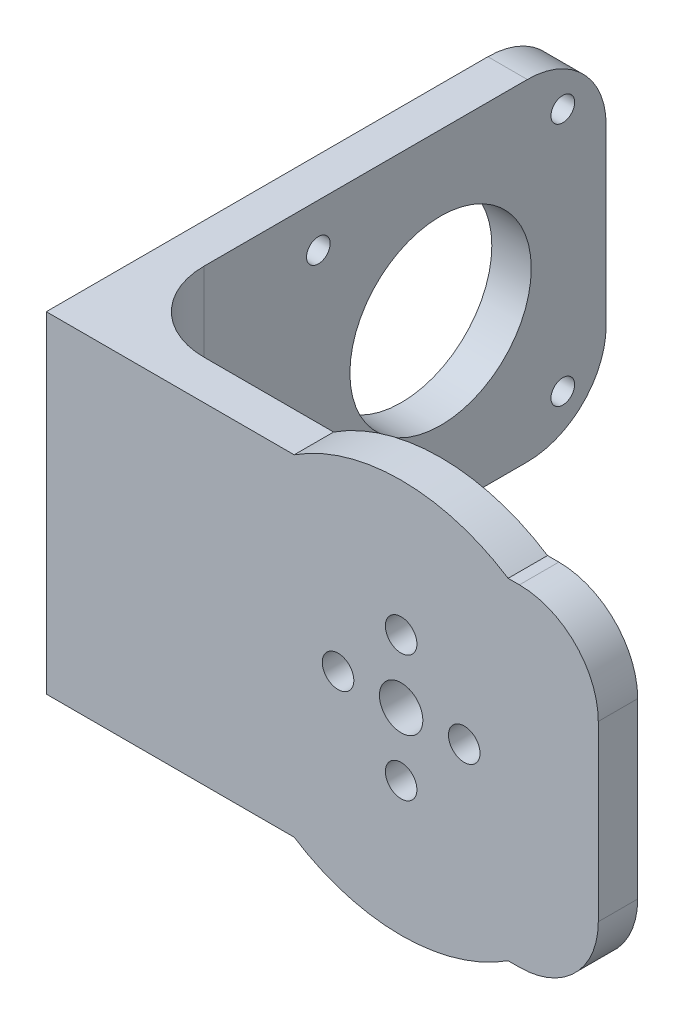
ISO-10303-21;
HEADER;
FILE_DESCRIPTION(('STEP AP214'),'2;1');
FILE_NAME('part.step','',(''),(''),'','','');
FILE_SCHEMA(('AUTOMOTIVE_DESIGN { 1 0 10303 214 1 1 1 1 }'));
ENDSEC;
DATA;
#1=APPLICATION_CONTEXT('core data for automotive mechanical design processes');
#2=APPLICATION_PROTOCOL_DEFINITION('international standard','automotive_design',2000,#1);
#3=PRODUCT_CONTEXT('',#1,'mechanical');
#4=PRODUCT('Part','Part','',(#3));
#5=PRODUCT_RELATED_PRODUCT_CATEGORY('part','',(#4));
#6=PRODUCT_DEFINITION_FORMATION('','',#4);
#7=PRODUCT_DEFINITION_CONTEXT('part definition',#1,'design');
#8=PRODUCT_DEFINITION('design','',#6,#7);
#9=PRODUCT_DEFINITION_SHAPE('','',#8);
#10=(LENGTH_UNIT() NAMED_UNIT(*) SI_UNIT(.MILLI.,.METRE.));
#11=(NAMED_UNIT(*) PLANE_ANGLE_UNIT() SI_UNIT($,.RADIAN.));
#12=(NAMED_UNIT(*) SI_UNIT($,.STERADIAN.) SOLID_ANGLE_UNIT());
#13=UNCERTAINTY_MEASURE_WITH_UNIT(LENGTH_MEASURE(1.E-05),#10,'distance_accuracy_value','');
#14=(GEOMETRIC_REPRESENTATION_CONTEXT(3) GLOBAL_UNCERTAINTY_ASSIGNED_CONTEXT((#13)) GLOBAL_UNIT_ASSIGNED_CONTEXT((#10,
#11,#12)) REPRESENTATION_CONTEXT('',''));
#15=CARTESIAN_POINT('',(0.,0.,0.));
#16=DIRECTION('',(0.,0.,1.));
#17=DIRECTION('',(1.,0.,0.));
#18=AXIS2_PLACEMENT_3D('',#15,#16,#17);
#19=CARTESIAN_POINT('',(0.,-21.,5.));
#20=DIRECTION('',(0.,-1.,0.));
#21=DIRECTION('',(0.,0.,-1.));
#22=AXIS2_PLACEMENT_3D('',#19,#20,#21);
#23=PLANE('',#22);
#24=DIRECTION('',(-1.,0.,0.));
#25=VECTOR('',#24,1.);
#26=CARTESIAN_POINT('',(0.,-21.,0.));
#27=LINE('',#26,#25);
#28=CARTESIAN_POINT('',(15.,-21.,0.));
#29=VERTEX_POINT('',#28);
#30=CARTESIAN_POINT('',(13.5646599662505,-21.,0.));
#31=VERTEX_POINT('',#30);
#32=EDGE_CURVE('E274',#29,#31,#27,.T.);
#33=ORIENTED_EDGE('',*,*,#32,.F.);
#34=DIRECTION('',(0.,0.,-1.));
#35=VECTOR('',#34,1.);
#36=CARTESIAN_POINT('',(15.,-21.,5.));
#37=LINE('',#36,#35);
#38=CARTESIAN_POINT('',(15.,-21.,5.));
#39=VERTEX_POINT('',#38);
#40=EDGE_CURVE('E335',#29,#39,#37,.F.);
#41=ORIENTED_EDGE('',*,*,#40,.T.);
#42=DIRECTION('',(-1.,0.,0.));
#43=VECTOR('',#42,1.);
#44=CARTESIAN_POINT('',(0.,-21.,5.));
#45=LINE('',#44,#43);
#46=CARTESIAN_POINT('',(13.5646599662505,-21.,5.));
#47=VERTEX_POINT('',#46);
#48=EDGE_CURVE('E277',#39,#47,#45,.T.);
#49=ORIENTED_EDGE('',*,*,#48,.T.);
#50=DIRECTION('',(0.,0.,-1.));
#51=VECTOR('',#50,1.);
#52=CARTESIAN_POINT('',(13.5646599662505,-21.,5.));
#53=LINE('',#52,#51);
#54=EDGE_CURVE('E279',#47,#31,#53,.T.);
#55=ORIENTED_EDGE('',*,*,#54,.T.);
#56=EDGE_LOOP('',(#33,#41,#49,#55));
#57=FACE_BOUND('',#56,.T.);
#58=ADVANCED_FACE('F119',(#57),#23,.T.);
#59=CARTESIAN_POINT('',(0.,-21.,5.));
#60=DIRECTION('',(0.,-1.,0.));
#61=DIRECTION('',(0.,0.,-1.));
#62=AXIS2_PLACEMENT_3D('',#59,#60,#61);
#63=PLANE('',#62);
#64=DIRECTION('',(0.,0.,1.));
#65=VECTOR('',#64,1.);
#66=CARTESIAN_POINT('',(-45.,-21.,-61.));
#67=LINE('',#66,#65);
#68=CARTESIAN_POINT('',(-45.,-21.,-51.));
#69=VERTEX_POINT('',#68);
#70=CARTESIAN_POINT('',(-45.,-21.,5.));
#71=VERTEX_POINT('',#70);
#72=EDGE_CURVE('E228',#69,#71,#67,.T.);
#73=ORIENTED_EDGE('',*,*,#72,.F.);
#74=DIRECTION('',(1.,0.,0.));
#75=VECTOR('',#74,1.);
#76=CARTESIAN_POINT('',(-40.,-21.,-51.));
#77=LINE('',#76,#75);
#78=CARTESIAN_POINT('',(-40.,-21.,-51.));
#79=VERTEX_POINT('',#78);
#80=EDGE_CURVE('E337',#69,#79,#77,.T.);
#81=ORIENTED_EDGE('',*,*,#80,.T.);
#82=DIRECTION('',(0.,0.,1.));
#83=VECTOR('',#82,1.);
#84=CARTESIAN_POINT('',(-40.,-21.,-61.));
#85=LINE('',#84,#83);
#86=CARTESIAN_POINT('',(-40.,-21.,-10.));
#87=VERTEX_POINT('',#86);
#88=EDGE_CURVE('E238',#79,#87,#85,.T.);
#89=ORIENTED_EDGE('',*,*,#88,.T.);
#90=CARTESIAN_POINT('',(-30.,-21.,-10.));
#91=DIRECTION('',(0.,-1.,0.));
#92=DIRECTION('',(0.,0.,-1.));
#93=AXIS2_PLACEMENT_3D('',#90,#91,#92);
#94=CIRCLE('',#93,10.);
#95=CARTESIAN_POINT('',(-30.,-21.,0.));
#96=VERTEX_POINT('',#95);
#97=EDGE_CURVE('E314',#87,#96,#94,.F.);
#98=ORIENTED_EDGE('',*,*,#97,.T.);
#99=DIRECTION('',(-1.,0.,0.));
#100=VECTOR('',#99,1.);
#101=CARTESIAN_POINT('',(0.,-21.,0.));
#102=LINE('',#101,#100);
#103=CARTESIAN_POINT('',(-13.5646599662505,-21.,0.));
#104=VERTEX_POINT('',#103);
#105=EDGE_CURVE('E286',#104,#96,#102,.T.);
#106=ORIENTED_EDGE('',*,*,#105,.F.);
#107=DIRECTION('',(0.,0.,-1.));
#108=VECTOR('',#107,1.);
#109=CARTESIAN_POINT('',(-13.5646599662505,-21.,5.));
#110=LINE('',#109,#108);
#111=CARTESIAN_POINT('',(-13.5646599662505,-21.,5.));
#112=VERTEX_POINT('',#111);
#113=EDGE_CURVE('E245',#112,#104,#110,.T.);
#114=ORIENTED_EDGE('',*,*,#113,.F.);
#115=DIRECTION('',(-1.,0.,0.));
#116=VECTOR('',#115,1.);
#117=CARTESIAN_POINT('',(0.,-21.,5.));
#118=LINE('',#117,#116);
#119=EDGE_CURVE('E242',#112,#71,#118,.T.);
#120=ORIENTED_EDGE('',*,*,#119,.T.);
#121=EDGE_LOOP('',(#73,#81,#89,#98,#106,#114,#120));
#122=FACE_BOUND('',#121,.T.);
#123=ADVANCED_FACE('F243',(#122),#63,.T.);
#124=CARTESIAN_POINT('',(25.,0.,5.));
#125=DIRECTION('',(-1.,0.,0.));
#126=DIRECTION('',(0.,0.,1.));
#127=AXIS2_PLACEMENT_3D('',#124,#125,#126);
#128=PLANE('',#127);
#129=DIRECTION('',(0.,1.,0.));
#130=VECTOR('',#129,1.);
#131=CARTESIAN_POINT('',(25.,0.,0.));
#132=LINE('',#131,#130);
#133=CARTESIAN_POINT('',(25.,-11.,0.));
#134=VERTEX_POINT('',#133);
#135=CARTESIAN_POINT('',(25.,11.,0.));
#136=VERTEX_POINT('',#135);
#137=EDGE_CURVE('E280',#134,#136,#132,.T.);
#138=ORIENTED_EDGE('',*,*,#137,.T.);
#139=DIRECTION('',(0.,0.,-1.));
#140=VECTOR('',#139,1.);
#141=CARTESIAN_POINT('',(25.,11.,5.));
#142=LINE('',#141,#140);
#143=CARTESIAN_POINT('',(25.,11.,5.));
#144=VERTEX_POINT('',#143);
#145=EDGE_CURVE('E329',#136,#144,#142,.F.);
#146=ORIENTED_EDGE('',*,*,#145,.T.);
#147=DIRECTION('',(0.,1.,0.));
#148=VECTOR('',#147,1.);
#149=CARTESIAN_POINT('',(25.,0.,5.));
#150=LINE('',#149,#148);
#151=CARTESIAN_POINT('',(25.,-11.,5.));
#152=VERTEX_POINT('',#151);
#153=EDGE_CURVE('E272',#152,#144,#150,.T.);
#154=ORIENTED_EDGE('',*,*,#153,.F.);
#155=DIRECTION('',(0.,0.,-1.));
#156=VECTOR('',#155,1.);
#157=CARTESIAN_POINT('',(25.,-11.,0.));
#158=LINE('',#157,#156);
#159=EDGE_CURVE('E326',#152,#134,#158,.T.);
#160=ORIENTED_EDGE('',*,*,#159,.T.);
#161=EDGE_LOOP('',(#138,#146,#154,#160));
#162=FACE_BOUND('',#161,.T.);
#163=ADVANCED_FACE('F379',(#162),#128,.F.);
#164=CARTESIAN_POINT('',(0.,0.,5.));
#165=DIRECTION('',(0.,0.,-1.));
#166=DIRECTION('',(-1.,0.,0.));
#167=AXIS2_PLACEMENT_3D('',#164,#165,#166);
#168=CYLINDRICAL_SURFACE('',#167,25.);
#169=CARTESIAN_POINT('',(0.,0.,0.));
#170=DIRECTION('',(0.,0.,1.));
#171=DIRECTION('',(1.,0.,0.));
#172=AXIS2_PLACEMENT_3D('',#169,#170,#171);
#173=CIRCLE('',#172,25.);
#174=EDGE_CURVE('E289',#104,#31,#173,.T.);
#175=ORIENTED_EDGE('',*,*,#174,.T.);
#176=ORIENTED_EDGE('',*,*,#54,.F.);
#177=CARTESIAN_POINT('',(0.,0.,5.));
#178=DIRECTION('',(0.,0.,1.));
#179=DIRECTION('',(1.,0.,0.));
#180=AXIS2_PLACEMENT_3D('',#177,#178,#179);
#181=CIRCLE('',#180,25.);
#182=EDGE_CURVE('E249',#112,#47,#181,.T.);
#183=ORIENTED_EDGE('',*,*,#182,.F.);
#184=ORIENTED_EDGE('',*,*,#113,.T.);
#185=EDGE_LOOP('',(#175,#176,#183,#184));
#186=FACE_BOUND('',#185,.T.);
#187=ADVANCED_FACE('F375',(#186),#168,.T.);
#188=CARTESIAN_POINT('',(0.,0.,0.));
#189=DIRECTION('',(0.,0.,1.));
#190=DIRECTION('',(1.,0.,0.));
#191=AXIS2_PLACEMENT_3D('',#188,#189,#190);
#192=PLANE('',#191);
#193=CARTESIAN_POINT('',(0.,8.,0.));
#194=DIRECTION('',(0.,0.,-1.));
#195=DIRECTION('',(-1.,0.,0.));
#196=AXIS2_PLACEMENT_3D('',#193,#194,#195);
#197=CIRCLE('',#196,2.);
#198=CARTESIAN_POINT('',(-2.,8.,0.));
#199=VERTEX_POINT('',#198);
#200=EDGE_CURVE('E467',#199,#199,#197,.T.);
#201=ORIENTED_EDGE('',*,*,#200,.F.);
#202=EDGE_LOOP('',(#201));
#203=FACE_BOUND('',#202,.T.);
#204=CARTESIAN_POINT('',(7.99999999999977,-2.26883816723573E-13,0.));
#205=DIRECTION('',(0.,0.,-1.));
#206=DIRECTION('',(-1.,0.,0.));
#207=AXIS2_PLACEMENT_3D('',#204,#205,#206);
#208=CIRCLE('',#207,2.00000000000036);
#209=CARTESIAN_POINT('',(5.99999999999941,-2.26883816723573E-13,0.));
#210=VERTEX_POINT('',#209);
#211=EDGE_CURVE('E475',#210,#210,#208,.T.);
#212=ORIENTED_EDGE('',*,*,#211,.F.);
#213=EDGE_LOOP('',(#212));
#214=FACE_BOUND('',#213,.T.);
#215=CARTESIAN_POINT('',(-4.51808198568511E-13,-8.,0.));
#216=DIRECTION('',(0.,0.,-1.));
#217=DIRECTION('',(-1.,0.,0.));
#218=AXIS2_PLACEMENT_3D('',#215,#216,#217);
#219=CIRCLE('',#218,2.00000000000049);
#220=CARTESIAN_POINT('',(-2.00000000000094,-8.,0.));
#221=VERTEX_POINT('',#220);
#222=EDGE_CURVE('E563',#221,#221,#219,.T.);
#223=ORIENTED_EDGE('',*,*,#222,.F.);
#224=EDGE_LOOP('',(#223));
#225=FACE_BOUND('',#224,.T.);
#226=CARTESIAN_POINT('',(-8.00000000000023,2.25904099284255E-13,0.));
#227=DIRECTION('',(0.,0.,-1.));
#228=DIRECTION('',(-1.,0.,0.));
#229=AXIS2_PLACEMENT_3D('',#226,#227,#228);
#230=CIRCLE('',#229,2.00000000000018);
#231=CARTESIAN_POINT('',(-10.0000000000004,2.25904099284255E-13,0.));
#232=VERTEX_POINT('',#231);
#233=EDGE_CURVE('E479',#232,#232,#230,.T.);
#234=ORIENTED_EDGE('',*,*,#233,.F.);
#235=EDGE_LOOP('',(#234));
#236=FACE_BOUND('',#235,.T.);
#237=CARTESIAN_POINT('',(0.,0.,0.));
#238=DIRECTION('',(0.,0.,-1.));
#239=DIRECTION('',(-1.,0.,0.));
#240=AXIS2_PLACEMENT_3D('',#237,#238,#239);
#241=CIRCLE('',#240,2.75);
#242=CARTESIAN_POINT('',(-2.75,0.,0.));
#243=VERTEX_POINT('',#242);
#244=EDGE_CURVE('E468',#243,#243,#241,.T.);
#245=ORIENTED_EDGE('',*,*,#244,.F.);
#246=EDGE_LOOP('',(#245));
#247=FACE_BOUND('',#246,.T.);
#248=DIRECTION('',(-1.,0.,0.));
#249=VECTOR('',#248,1.);
#250=CARTESIAN_POINT('',(25.,21.,0.));
#251=LINE('',#250,#249);
#252=CARTESIAN_POINT('',(15.,21.,0.));
#253=VERTEX_POINT('',#252);
#254=CARTESIAN_POINT('',(13.5646599662506,21.,0.));
#255=VERTEX_POINT('',#254);
#256=EDGE_CURVE('E268',#253,#255,#251,.T.);
#257=ORIENTED_EDGE('',*,*,#256,.F.);
#258=CARTESIAN_POINT('',(15.,11.,0.));
#259=DIRECTION('',(0.,0.,1.));
#260=DIRECTION('',(1.,0.,0.));
#261=AXIS2_PLACEMENT_3D('',#258,#259,#260);
#262=CIRCLE('',#261,10.);
#263=EDGE_CURVE('E324',#253,#136,#262,.F.);
#264=ORIENTED_EDGE('',*,*,#263,.T.);
#265=ORIENTED_EDGE('',*,*,#137,.F.);
#266=CARTESIAN_POINT('',(15.,-11.,0.));
#267=DIRECTION('',(0.,0.,1.));
#268=DIRECTION('',(1.,0.,0.));
#269=AXIS2_PLACEMENT_3D('',#266,#267,#268);
#270=CIRCLE('',#269,10.);
#271=EDGE_CURVE('E322',#134,#29,#270,.F.);
#272=ORIENTED_EDGE('',*,*,#271,.T.);
#273=ORIENTED_EDGE('',*,*,#32,.T.);
#274=ORIENTED_EDGE('',*,*,#174,.F.);
#275=ORIENTED_EDGE('',*,*,#105,.T.);
#276=DIRECTION('',(0.,-1.,0.));
#277=VECTOR('',#276,1.);
#278=CARTESIAN_POINT('',(-30.,0.,0.));
#279=LINE('',#278,#277);
#280=CARTESIAN_POINT('',(-30.,21.,0.));
#281=VERTEX_POINT('',#280);
#282=EDGE_CURVE('E312',#96,#281,#279,.F.);
#283=ORIENTED_EDGE('',*,*,#282,.T.);
#284=DIRECTION('',(-1.,0.,0.));
#285=VECTOR('',#284,1.);
#286=CARTESIAN_POINT('',(-25.,21.,0.));
#287=LINE('',#286,#285);
#288=CARTESIAN_POINT('',(-13.5646599662506,21.,0.));
#289=VERTEX_POINT('',#288);
#290=EDGE_CURVE('E298',#289,#281,#287,.T.);
#291=ORIENTED_EDGE('',*,*,#290,.F.);
#292=CARTESIAN_POINT('',(0.,0.,0.));
#293=DIRECTION('',(0.,0.,1.));
#294=DIRECTION('',(1.,0.,0.));
#295=AXIS2_PLACEMENT_3D('',#292,#293,#294);
#296=CIRCLE('',#295,25.);
#297=EDGE_CURVE('E283',#255,#289,#296,.T.);
#298=ORIENTED_EDGE('',*,*,#297,.F.);
#299=EDGE_LOOP('',(#257,#264,#265,#272,#273,#274,#275,#283,#291,#298));
#300=FACE_BOUND('',#299,.T.);
#301=ADVANCED_FACE('F385',(#203,#214,#225,#236,#247,#300),#192,.F.);
#302=CARTESIAN_POINT('',(0.,0.,5.));
#303=DIRECTION('',(0.,0.,1.));
#304=DIRECTION('',(1.,0.,0.));
#305=AXIS2_PLACEMENT_3D('',#302,#303,#304);
#306=PLANE('',#305);
#307=CARTESIAN_POINT('',(0.,8.,5.));
#308=DIRECTION('',(0.,0.,-1.));
#309=DIRECTION('',(-1.,0.,0.));
#310=AXIS2_PLACEMENT_3D('',#307,#308,#309);
#311=CIRCLE('',#310,2.);
#312=CARTESIAN_POINT('',(-2.,8.,5.));
#313=VERTEX_POINT('',#312);
#314=EDGE_CURVE('E450',#313,#313,#311,.T.);
#315=ORIENTED_EDGE('',*,*,#314,.T.);
#316=EDGE_LOOP('',(#315));
#317=FACE_BOUND('',#316,.T.);
#318=CARTESIAN_POINT('',(7.99999999999977,-2.26883816723573E-13,5.));
#319=DIRECTION('',(0.,0.,-1.));
#320=DIRECTION('',(-1.,0.,0.));
#321=AXIS2_PLACEMENT_3D('',#318,#319,#320);
#322=CIRCLE('',#321,2.00000000000036);
#323=CARTESIAN_POINT('',(5.99999999999941,-2.26883816723573E-13,5.));
#324=VERTEX_POINT('',#323);
#325=EDGE_CURVE('E454',#324,#324,#322,.T.);
#326=ORIENTED_EDGE('',*,*,#325,.T.);
#327=EDGE_LOOP('',(#326));
#328=FACE_BOUND('',#327,.T.);
#329=CARTESIAN_POINT('',(-4.51808198568511E-13,-8.,5.));
#330=DIRECTION('',(0.,0.,-1.));
#331=DIRECTION('',(-1.,0.,0.));
#332=AXIS2_PLACEMENT_3D('',#329,#330,#331);
#333=CIRCLE('',#332,2.00000000000049);
#334=CARTESIAN_POINT('',(-2.00000000000094,-8.,5.));
#335=VERTEX_POINT('',#334);
#336=EDGE_CURVE('E458',#335,#335,#333,.T.);
#337=ORIENTED_EDGE('',*,*,#336,.T.);
#338=EDGE_LOOP('',(#337));
#339=FACE_BOUND('',#338,.T.);
#340=CARTESIAN_POINT('',(-8.00000000000023,2.25904099284255E-13,5.));
#341=DIRECTION('',(0.,0.,-1.));
#342=DIRECTION('',(-1.,0.,0.));
#343=AXIS2_PLACEMENT_3D('',#340,#341,#342);
#344=CIRCLE('',#343,2.00000000000018);
#345=CARTESIAN_POINT('',(-10.0000000000004,2.25904099284255E-13,5.));
#346=VERTEX_POINT('',#345);
#347=EDGE_CURVE('E462',#346,#346,#344,.T.);
#348=ORIENTED_EDGE('',*,*,#347,.T.);
#349=EDGE_LOOP('',(#348));
#350=FACE_BOUND('',#349,.T.);
#351=CARTESIAN_POINT('',(0.,0.,5.));
#352=DIRECTION('',(0.,0.,-1.));
#353=DIRECTION('',(-1.,0.,0.));
#354=AXIS2_PLACEMENT_3D('',#351,#352,#353);
#355=CIRCLE('',#354,2.75);
#356=CARTESIAN_POINT('',(-2.75,0.,5.));
#357=VERTEX_POINT('',#356);
#358=EDGE_CURVE('E465',#357,#357,#355,.T.);
#359=ORIENTED_EDGE('',*,*,#358,.T.);
#360=EDGE_LOOP('',(#359));
#361=FACE_BOUND('',#360,.T.);
#362=ORIENTED_EDGE('',*,*,#153,.T.);
#363=CARTESIAN_POINT('',(15.,11.,5.));
#364=DIRECTION('',(0.,0.,1.));
#365=DIRECTION('',(1.,0.,0.));
#366=AXIS2_PLACEMENT_3D('',#363,#364,#365);
#367=CIRCLE('',#366,10.);
#368=CARTESIAN_POINT('',(15.,21.,5.));
#369=VERTEX_POINT('',#368);
#370=EDGE_CURVE('E333',#144,#369,#367,.T.);
#371=ORIENTED_EDGE('',*,*,#370,.T.);
#372=DIRECTION('',(-1.,0.,0.));
#373=VECTOR('',#372,1.);
#374=CARTESIAN_POINT('',(25.,21.,5.));
#375=LINE('',#374,#373);
#376=CARTESIAN_POINT('',(13.5646599662506,21.,5.));
#377=VERTEX_POINT('',#376);
#378=EDGE_CURVE('E301',#369,#377,#375,.T.);
#379=ORIENTED_EDGE('',*,*,#378,.T.);
#380=CARTESIAN_POINT('',(0.,0.,5.));
#381=DIRECTION('',(0.,0.,1.));
#382=DIRECTION('',(1.,0.,0.));
#383=AXIS2_PLACEMENT_3D('',#380,#381,#382);
#384=CIRCLE('',#383,25.);
#385=CARTESIAN_POINT('',(-13.5646599662506,21.,5.));
#386=VERTEX_POINT('',#385);
#387=EDGE_CURVE('E250',#377,#386,#384,.T.);
#388=ORIENTED_EDGE('',*,*,#387,.T.);
#389=DIRECTION('',(-1.,0.,0.));
#390=VECTOR('',#389,1.);
#391=CARTESIAN_POINT('',(-25.,21.,5.));
#392=LINE('',#391,#390);
#393=CARTESIAN_POINT('',(-45.,21.,5.));
#394=VERTEX_POINT('',#393);
#395=EDGE_CURVE('E256',#386,#394,#392,.T.);
#396=ORIENTED_EDGE('',*,*,#395,.T.);
#397=DIRECTION('',(0.,-1.,0.));
#398=VECTOR('',#397,1.);
#399=CARTESIAN_POINT('',(-45.,21.,5.));
#400=LINE('',#399,#398);
#401=EDGE_CURVE('E233',#394,#71,#400,.T.);
#402=ORIENTED_EDGE('',*,*,#401,.T.);
#403=ORIENTED_EDGE('',*,*,#119,.F.);
#404=ORIENTED_EDGE('',*,*,#182,.T.);
#405=ORIENTED_EDGE('',*,*,#48,.F.);
#406=CARTESIAN_POINT('',(15.,-11.,5.));
#407=DIRECTION('',(0.,0.,1.));
#408=DIRECTION('',(1.,0.,0.));
#409=AXIS2_PLACEMENT_3D('',#406,#407,#408);
#410=CIRCLE('',#409,10.);
#411=EDGE_CURVE('E331',#39,#152,#410,.T.);
#412=ORIENTED_EDGE('',*,*,#411,.T.);
#413=EDGE_LOOP('',(#362,#371,#379,#388,#396,#402,#403,#404,#405,#412));
#414=FACE_BOUND('',#413,.T.);
#415=ADVANCED_FACE('F254',(#317,#328,#339,#350,#361,#414),#306,.T.);
#416=CARTESIAN_POINT('',(25.,21.,5.));
#417=DIRECTION('',(0.,-1.,0.));
#418=DIRECTION('',(0.,0.,-1.));
#419=AXIS2_PLACEMENT_3D('',#416,#417,#418);
#420=PLANE('',#419);
#421=DIRECTION('',(0.,0.,1.));
#422=VECTOR('',#421,1.);
#423=CARTESIAN_POINT('',(-40.,21.,-61.));
#424=LINE('',#423,#422);
#425=CARTESIAN_POINT('',(-40.,21.,-51.));
#426=VERTEX_POINT('',#425);
#427=CARTESIAN_POINT('',(-40.,21.,-10.));
#428=VERTEX_POINT('',#427);
#429=EDGE_CURVE('E269',#426,#428,#424,.T.);
#430=ORIENTED_EDGE('',*,*,#429,.F.);
#431=DIRECTION('',(-1.,0.,0.));
#432=VECTOR('',#431,1.);
#433=CARTESIAN_POINT('',(25.,21.,-51.));
#434=LINE('',#433,#432);
#435=CARTESIAN_POINT('',(-45.,21.,-51.));
#436=VERTEX_POINT('',#435);
#437=EDGE_CURVE('E12',#426,#436,#434,.T.);
#438=ORIENTED_EDGE('',*,*,#437,.T.);
#439=DIRECTION('',(0.,0.,1.));
#440=VECTOR('',#439,1.);
#441=CARTESIAN_POINT('',(-45.,21.,-61.));
#442=LINE('',#441,#440);
#443=EDGE_CURVE('E266',#436,#394,#442,.T.);
#444=ORIENTED_EDGE('',*,*,#443,.T.);
#445=ORIENTED_EDGE('',*,*,#395,.F.);
#446=DIRECTION('',(0.,0.,-1.));
#447=VECTOR('',#446,1.);
#448=CARTESIAN_POINT('',(-13.5646599662506,21.,5.));
#449=LINE('',#448,#447);
#450=EDGE_CURVE('E306',#386,#289,#449,.T.);
#451=ORIENTED_EDGE('',*,*,#450,.T.);
#452=ORIENTED_EDGE('',*,*,#290,.T.);
#453=CARTESIAN_POINT('',(-30.,21.,-10.));
#454=DIRECTION('',(0.,-1.,0.));
#455=DIRECTION('',(0.,0.,-1.));
#456=AXIS2_PLACEMENT_3D('',#453,#454,#455);
#457=CIRCLE('',#456,10.);
#458=EDGE_CURVE('E316',#281,#428,#457,.T.);
#459=ORIENTED_EDGE('',*,*,#458,.T.);
#460=EDGE_LOOP('',(#430,#438,#444,#445,#451,#452,#459));
#461=FACE_BOUND('',#460,.T.);
#462=ADVANCED_FACE('F354',(#461),#420,.F.);
#463=CARTESIAN_POINT('',(0.,0.,5.));
#464=DIRECTION('',(0.,0.,-1.));
#465=DIRECTION('',(-1.,0.,0.));
#466=AXIS2_PLACEMENT_3D('',#463,#464,#465);
#467=CYLINDRICAL_SURFACE('',#466,25.);
#468=ORIENTED_EDGE('',*,*,#450,.F.);
#469=ORIENTED_EDGE('',*,*,#387,.F.);
#470=DIRECTION('',(0.,0.,-1.));
#471=VECTOR('',#470,1.);
#472=CARTESIAN_POINT('',(13.5646599662506,21.,5.));
#473=LINE('',#472,#471);
#474=EDGE_CURVE('E296',#255,#377,#473,.F.);
#475=ORIENTED_EDGE('',*,*,#474,.F.);
#476=ORIENTED_EDGE('',*,*,#297,.T.);
#477=EDGE_LOOP('',(#468,#469,#475,#476));
#478=FACE_BOUND('',#477,.T.);
#479=ADVANCED_FACE('F394',(#478),#467,.T.);
#480=ORIENTED_EDGE('',*,*,#378,.F.);
#481=DIRECTION('',(0.,0.,-1.));
#482=VECTOR('',#481,1.);
#483=CARTESIAN_POINT('',(15.,21.,5.));
#484=LINE('',#483,#482);
#485=EDGE_CURVE('E319',#369,#253,#484,.T.);
#486=ORIENTED_EDGE('',*,*,#485,.T.);
#487=ORIENTED_EDGE('',*,*,#256,.T.);
#488=ORIENTED_EDGE('',*,*,#474,.T.);
#489=EDGE_LOOP('',(#480,#486,#487,#488));
#490=FACE_BOUND('',#489,.T.);
#491=ADVANCED_FACE('F397',(#490),#420,.F.);
#492=CARTESIAN_POINT('',(-45.,21.,-61.));
#493=DIRECTION('',(-1.,0.,0.));
#494=DIRECTION('',(0.,-1.,0.));
#495=AXIS2_PLACEMENT_3D('',#492,#493,#494);
#496=PLANE('',#495);
#497=CARTESIAN_POINT('',(-45.,-15.5000000000001,-24.4999999999996));
#498=DIRECTION('',(-1.,0.,0.));
#499=DIRECTION('',(0.,0.,1.));
#500=AXIS2_PLACEMENT_3D('',#497,#498,#499);
#501=CIRCLE('',#500,1.5);
#502=CARTESIAN_POINT('',(-45.,-15.5000000000001,-22.9999999999996));
#503=VERTEX_POINT('',#502);
#504=EDGE_CURVE('E503',#503,#503,#501,.T.);
#505=ORIENTED_EDGE('',*,*,#504,.F.);
#506=EDGE_LOOP('',(#505));
#507=FACE_BOUND('',#506,.T.);
#508=CARTESIAN_POINT('',(-45.,15.5,-24.5));
#509=DIRECTION('',(-1.,0.,0.));
#510=DIRECTION('',(0.,0.,1.));
#511=AXIS2_PLACEMENT_3D('',#508,#509,#510);
#512=CIRCLE('',#511,1.5);
#513=CARTESIAN_POINT('',(-45.,15.5,-23.));
#514=VERTEX_POINT('',#513);
#515=EDGE_CURVE('E497',#514,#514,#512,.T.);
#516=ORIENTED_EDGE('',*,*,#515,.F.);
#517=EDGE_LOOP('',(#516));
#518=FACE_BOUND('',#517,.T.);
#519=CARTESIAN_POINT('',(-45.,-15.5000000000004,-55.4999999999997));
#520=DIRECTION('',(-1.,0.,0.));
#521=DIRECTION('',(0.,0.,1.));
#522=AXIS2_PLACEMENT_3D('',#519,#520,#521);
#523=CIRCLE('',#522,1.49999999999999);
#524=CARTESIAN_POINT('',(-45.,-15.5000000000004,-53.9999999999997));
#525=VERTEX_POINT('',#524);
#526=EDGE_CURVE('E491',#525,#525,#523,.T.);
#527=ORIENTED_EDGE('',*,*,#526,.F.);
#528=EDGE_LOOP('',(#527));
#529=FACE_BOUND('',#528,.T.);
#530=CARTESIAN_POINT('',(-45.,15.4999999999997,-55.4999999999998));
#531=DIRECTION('',(-1.,0.,0.));
#532=DIRECTION('',(0.,0.,1.));
#533=AXIS2_PLACEMENT_3D('',#530,#531,#532);
#534=CIRCLE('',#533,1.5);
#535=CARTESIAN_POINT('',(-45.,15.4999999999997,-53.9999999999998));
#536=VERTEX_POINT('',#535);
#537=EDGE_CURVE('E485',#536,#536,#534,.T.);
#538=ORIENTED_EDGE('',*,*,#537,.F.);
#539=EDGE_LOOP('',(#538));
#540=FACE_BOUND('',#539,.T.);
#541=CARTESIAN_POINT('',(-45.,0.,-40.));
#542=DIRECTION('',(-1.,0.,0.));
#543=DIRECTION('',(0.,0.,1.));
#544=AXIS2_PLACEMENT_3D('',#541,#542,#543);
#545=CIRCLE('',#544,11.5);
#546=CARTESIAN_POINT('',(-45.,0.,-28.5));
#547=VERTEX_POINT('',#546);
#548=EDGE_CURVE('E262',#547,#547,#545,.T.);
#549=ORIENTED_EDGE('',*,*,#548,.F.);
#550=EDGE_LOOP('',(#549));
#551=FACE_BOUND('',#550,.T.);
#552=DIRECTION('',(0.,-1.,0.));
#553=VECTOR('',#552,1.);
#554=CARTESIAN_POINT('',(-45.,21.,-61.));
#555=LINE('',#554,#553);
#556=CARTESIAN_POINT('',(-45.,11.,-61.));
#557=VERTEX_POINT('',#556);
#558=CARTESIAN_POINT('',(-45.,-11.,-61.));
#559=VERTEX_POINT('',#558);
#560=EDGE_CURVE('E257',#557,#559,#555,.T.);
#561=ORIENTED_EDGE('',*,*,#560,.T.);
#562=CARTESIAN_POINT('',(-45.,-11.,-51.));
#563=DIRECTION('',(-1.,0.,0.));
#564=DIRECTION('',(0.,-1.,0.));
#565=AXIS2_PLACEMENT_3D('',#562,#563,#564);
#566=CIRCLE('',#565,10.);
#567=EDGE_CURVE('E127',#559,#69,#566,.T.);
#568=ORIENTED_EDGE('',*,*,#567,.T.);
#569=ORIENTED_EDGE('',*,*,#72,.T.);
#570=ORIENTED_EDGE('',*,*,#401,.F.);
#571=ORIENTED_EDGE('',*,*,#443,.F.);
#572=CARTESIAN_POINT('',(-45.,11.,-51.));
#573=DIRECTION('',(-1.,0.,0.));
#574=DIRECTION('',(0.,-1.,0.));
#575=AXIS2_PLACEMENT_3D('',#572,#573,#574);
#576=CIRCLE('',#575,10.);
#577=EDGE_CURVE('E134',#436,#557,#576,.T.);
#578=ORIENTED_EDGE('',*,*,#577,.T.);
#579=EDGE_LOOP('',(#561,#568,#569,#570,#571,#578));
#580=FACE_BOUND('',#579,.T.);
#581=ADVANCED_FACE('F230',(#507,#518,#529,#540,#551,#580),#496,.T.);
#582=CARTESIAN_POINT('',(-40.,21.,-61.));
#583=DIRECTION('',(1.,0.,0.));
#584=DIRECTION('',(0.,1.,0.));
#585=AXIS2_PLACEMENT_3D('',#582,#583,#584);
#586=PLANE('',#585);
#587=CARTESIAN_POINT('',(-40.,-15.5000000000001,-24.4999999999996));
#588=DIRECTION('',(-1.,0.,0.));
#589=DIRECTION('',(0.,0.,1.));
#590=AXIS2_PLACEMENT_3D('',#587,#588,#589);
#591=CIRCLE('',#590,1.5);
#592=CARTESIAN_POINT('',(-40.,-15.5000000000001,-22.9999999999996));
#593=VERTEX_POINT('',#592);
#594=EDGE_CURVE('E500',#593,#593,#591,.T.);
#595=ORIENTED_EDGE('',*,*,#594,.T.);
#596=EDGE_LOOP('',(#595));
#597=FACE_BOUND('',#596,.T.);
#598=CARTESIAN_POINT('',(-40.,15.5,-24.5));
#599=DIRECTION('',(-1.,0.,0.));
#600=DIRECTION('',(0.,0.,1.));
#601=AXIS2_PLACEMENT_3D('',#598,#599,#600);
#602=CIRCLE('',#601,1.5);
#603=CARTESIAN_POINT('',(-40.,15.5,-23.));
#604=VERTEX_POINT('',#603);
#605=EDGE_CURVE('E494',#604,#604,#602,.T.);
#606=ORIENTED_EDGE('',*,*,#605,.T.);
#607=EDGE_LOOP('',(#606));
#608=FACE_BOUND('',#607,.T.);
#609=CARTESIAN_POINT('',(-40.,-15.5000000000004,-55.4999999999997));
#610=DIRECTION('',(-1.,0.,0.));
#611=DIRECTION('',(0.,0.,1.));
#612=AXIS2_PLACEMENT_3D('',#609,#610,#611);
#613=CIRCLE('',#612,1.49999999999999);
#614=CARTESIAN_POINT('',(-40.,-15.5000000000004,-53.9999999999997));
#615=VERTEX_POINT('',#614);
#616=EDGE_CURVE('E488',#615,#615,#613,.T.);
#617=ORIENTED_EDGE('',*,*,#616,.T.);
#618=EDGE_LOOP('',(#617));
#619=FACE_BOUND('',#618,.T.);
#620=CARTESIAN_POINT('',(-40.,15.4999999999997,-55.4999999999998));
#621=DIRECTION('',(-1.,0.,0.));
#622=DIRECTION('',(0.,0.,1.));
#623=AXIS2_PLACEMENT_3D('',#620,#621,#622);
#624=CIRCLE('',#623,1.5);
#625=CARTESIAN_POINT('',(-40.,15.4999999999997,-53.9999999999998));
#626=VERTEX_POINT('',#625);
#627=EDGE_CURVE('E482',#626,#626,#624,.T.);
#628=ORIENTED_EDGE('',*,*,#627,.T.);
#629=EDGE_LOOP('',(#628));
#630=FACE_BOUND('',#629,.T.);
#631=CARTESIAN_POINT('',(-40.,0.,-40.));
#632=DIRECTION('',(-1.,0.,0.));
#633=DIRECTION('',(0.,0.,1.));
#634=AXIS2_PLACEMENT_3D('',#631,#632,#633);
#635=CIRCLE('',#634,11.5);
#636=CARTESIAN_POINT('',(-40.,0.,-28.5));
#637=VERTEX_POINT('',#636);
#638=EDGE_CURVE('E258',#637,#637,#635,.T.);
#639=ORIENTED_EDGE('',*,*,#638,.T.);
#640=EDGE_LOOP('',(#639));
#641=FACE_BOUND('',#640,.T.);
#642=ORIENTED_EDGE('',*,*,#88,.F.);
#643=CARTESIAN_POINT('',(-40.,-11.,-51.));
#644=DIRECTION('',(1.,0.,0.));
#645=DIRECTION('',(0.,1.,0.));
#646=AXIS2_PLACEMENT_3D('',#643,#644,#645);
#647=CIRCLE('',#646,10.);
#648=CARTESIAN_POINT('',(-40.,-11.,-61.));
#649=VERTEX_POINT('',#648);
#650=EDGE_CURVE('E341',#79,#649,#647,.T.);
#651=ORIENTED_EDGE('',*,*,#650,.T.);
#652=DIRECTION('',(0.,1.,0.));
#653=VECTOR('',#652,1.);
#654=CARTESIAN_POINT('',(-40.,21.,-61.));
#655=LINE('',#654,#653);
#656=CARTESIAN_POINT('',(-40.,11.,-61.));
#657=VERTEX_POINT('',#656);
#658=EDGE_CURVE('E239',#649,#657,#655,.T.);
#659=ORIENTED_EDGE('',*,*,#658,.T.);
#660=CARTESIAN_POINT('',(-40.,11.,-51.));
#661=DIRECTION('',(1.,0.,0.));
#662=DIRECTION('',(0.,1.,0.));
#663=AXIS2_PLACEMENT_3D('',#660,#661,#662);
#664=CIRCLE('',#663,10.);
#665=EDGE_CURVE('E339',#657,#426,#664,.T.);
#666=ORIENTED_EDGE('',*,*,#665,.T.);
#667=ORIENTED_EDGE('',*,*,#429,.T.);
#668=DIRECTION('',(0.,-1.,0.));
#669=VECTOR('',#668,1.);
#670=CARTESIAN_POINT('',(-40.,21.,-10.));
#671=LINE('',#670,#669);
#672=EDGE_CURVE('E309',#428,#87,#671,.T.);
#673=ORIENTED_EDGE('',*,*,#672,.T.);
#674=EDGE_LOOP('',(#642,#651,#659,#666,#667,#673));
#675=FACE_BOUND('',#674,.T.);
#676=ADVANCED_FACE('F352',(#597,#608,#619,#630,#641,#675),#586,.T.);
#677=CARTESIAN_POINT('',(0.,0.,-61.));
#678=DIRECTION('',(0.,0.,1.));
#679=DIRECTION('',(1.,0.,0.));
#680=AXIS2_PLACEMENT_3D('',#677,#678,#679);
#681=PLANE('',#680);
#682=ORIENTED_EDGE('',*,*,#658,.F.);
#683=DIRECTION('',(1.,0.,0.));
#684=VECTOR('',#683,1.);
#685=CARTESIAN_POINT('',(-45.,-11.,-61.));
#686=LINE('',#685,#684);
#687=EDGE_CURVE('E141',#649,#559,#686,.F.);
#688=ORIENTED_EDGE('',*,*,#687,.T.);
#689=ORIENTED_EDGE('',*,*,#560,.F.);
#690=DIRECTION('',(-1.,0.,0.));
#691=VECTOR('',#690,1.);
#692=CARTESIAN_POINT('',(0.,11.,-61.));
#693=LINE('',#692,#691);
#694=EDGE_CURVE('E343',#557,#657,#693,.F.);
#695=ORIENTED_EDGE('',*,*,#694,.T.);
#696=EDGE_LOOP('',(#682,#688,#689,#695));
#697=FACE_BOUND('',#696,.T.);
#698=ADVANCED_FACE('F346',(#697),#681,.F.);
#699=CARTESIAN_POINT('',(-40.,0.,-40.));
#700=DIRECTION('',(-1.,0.,0.));
#701=DIRECTION('',(0.,0.,1.));
#702=AXIS2_PLACEMENT_3D('',#699,#700,#701);
#703=CYLINDRICAL_SURFACE('',#702,11.5);
#704=ORIENTED_EDGE('',*,*,#638,.F.);
#705=EDGE_LOOP('',(#704));
#706=FACE_BOUND('',#705,.T.);
#707=ORIENTED_EDGE('',*,*,#548,.T.);
#708=EDGE_LOOP('',(#707));
#709=FACE_BOUND('',#708,.T.);
#710=ADVANCED_FACE('F509',(#706,#709),#703,.F.);
#711=CARTESIAN_POINT('',(-40.,15.4999999999997,-55.4999999999998));
#712=DIRECTION('',(-1.,0.,0.));
#713=DIRECTION('',(0.,0.,1.));
#714=AXIS2_PLACEMENT_3D('',#711,#712,#713);
#715=CYLINDRICAL_SURFACE('',#714,1.5);
#716=ORIENTED_EDGE('',*,*,#627,.F.);
#717=EDGE_LOOP('',(#716));
#718=FACE_BOUND('',#717,.T.);
#719=ORIENTED_EDGE('',*,*,#537,.T.);
#720=EDGE_LOOP('',(#719));
#721=FACE_BOUND('',#720,.T.);
#722=ADVANCED_FACE('F512',(#718,#721),#715,.F.);
#723=CARTESIAN_POINT('',(-40.,-15.5000000000004,-55.4999999999997));
#724=DIRECTION('',(-1.,0.,0.));
#725=DIRECTION('',(0.,0.,1.));
#726=AXIS2_PLACEMENT_3D('',#723,#724,#725);
#727=CYLINDRICAL_SURFACE('',#726,1.49999999999999);
#728=ORIENTED_EDGE('',*,*,#616,.F.);
#729=EDGE_LOOP('',(#728));
#730=FACE_BOUND('',#729,.T.);
#731=ORIENTED_EDGE('',*,*,#526,.T.);
#732=EDGE_LOOP('',(#731));
#733=FACE_BOUND('',#732,.T.);
#734=ADVANCED_FACE('F519',(#730,#733),#727,.F.);
#735=CARTESIAN_POINT('',(-40.,15.5,-24.5));
#736=DIRECTION('',(-1.,0.,0.));
#737=DIRECTION('',(0.,0.,1.));
#738=AXIS2_PLACEMENT_3D('',#735,#736,#737);
#739=CYLINDRICAL_SURFACE('',#738,1.5);
#740=ORIENTED_EDGE('',*,*,#605,.F.);
#741=EDGE_LOOP('',(#740));
#742=FACE_BOUND('',#741,.T.);
#743=ORIENTED_EDGE('',*,*,#515,.T.);
#744=EDGE_LOOP('',(#743));
#745=FACE_BOUND('',#744,.T.);
#746=ADVANCED_FACE('F528',(#742,#745),#739,.F.);
#747=CARTESIAN_POINT('',(-40.,-15.5000000000001,-24.4999999999996));
#748=DIRECTION('',(-1.,0.,0.));
#749=DIRECTION('',(0.,0.,1.));
#750=AXIS2_PLACEMENT_3D('',#747,#748,#749);
#751=CYLINDRICAL_SURFACE('',#750,1.5);
#752=ORIENTED_EDGE('',*,*,#594,.F.);
#753=EDGE_LOOP('',(#752));
#754=FACE_BOUND('',#753,.T.);
#755=ORIENTED_EDGE('',*,*,#504,.T.);
#756=EDGE_LOOP('',(#755));
#757=FACE_BOUND('',#756,.T.);
#758=ADVANCED_FACE('F524',(#754,#757),#751,.F.);
#759=CARTESIAN_POINT('',(0.,0.,5.));
#760=DIRECTION('',(0.,0.,-1.));
#761=DIRECTION('',(-1.,0.,0.));
#762=AXIS2_PLACEMENT_3D('',#759,#760,#761);
#763=CYLINDRICAL_SURFACE('',#762,2.75);
#764=ORIENTED_EDGE('',*,*,#358,.F.);
#765=EDGE_LOOP('',(#764));
#766=FACE_BOUND('',#765,.T.);
#767=ORIENTED_EDGE('',*,*,#244,.T.);
#768=EDGE_LOOP('',(#767));
#769=FACE_BOUND('',#768,.T.);
#770=ADVANCED_FACE('F527',(#766,#769),#763,.F.);
#771=CARTESIAN_POINT('',(-8.00000000000023,2.25904099284255E-13,5.));
#772=DIRECTION('',(0.,0.,-1.));
#773=DIRECTION('',(-1.,0.,0.));
#774=AXIS2_PLACEMENT_3D('',#771,#772,#773);
#775=CYLINDRICAL_SURFACE('',#774,2.00000000000018);
#776=ORIENTED_EDGE('',*,*,#347,.F.);
#777=EDGE_LOOP('',(#776));
#778=FACE_BOUND('',#777,.T.);
#779=ORIENTED_EDGE('',*,*,#233,.T.);
#780=EDGE_LOOP('',(#779));
#781=FACE_BOUND('',#780,.T.);
#782=ADVANCED_FACE('F536',(#778,#781),#775,.F.);
#783=CARTESIAN_POINT('',(-4.51808198568511E-13,-8.,5.));
#784=DIRECTION('',(0.,0.,-1.));
#785=DIRECTION('',(-1.,0.,0.));
#786=AXIS2_PLACEMENT_3D('',#783,#784,#785);
#787=CYLINDRICAL_SURFACE('',#786,2.00000000000049);
#788=ORIENTED_EDGE('',*,*,#336,.F.);
#789=EDGE_LOOP('',(#788));
#790=FACE_BOUND('',#789,.T.);
#791=ORIENTED_EDGE('',*,*,#222,.T.);
#792=EDGE_LOOP('',(#791));
#793=FACE_BOUND('',#792,.T.);
#794=ADVANCED_FACE('F539',(#790,#793),#787,.F.);
#795=CARTESIAN_POINT('',(7.99999999999977,-2.26883816723573E-13,5.));
#796=DIRECTION('',(0.,0.,-1.));
#797=DIRECTION('',(-1.,0.,0.));
#798=AXIS2_PLACEMENT_3D('',#795,#796,#797);
#799=CYLINDRICAL_SURFACE('',#798,2.00000000000036);
#800=ORIENTED_EDGE('',*,*,#325,.F.);
#801=EDGE_LOOP('',(#800));
#802=FACE_BOUND('',#801,.T.);
#803=ORIENTED_EDGE('',*,*,#211,.T.);
#804=EDGE_LOOP('',(#803));
#805=FACE_BOUND('',#804,.T.);
#806=ADVANCED_FACE('F543',(#802,#805),#799,.F.);
#807=CARTESIAN_POINT('',(0.,8.,5.));
#808=DIRECTION('',(0.,0.,-1.));
#809=DIRECTION('',(-1.,0.,0.));
#810=AXIS2_PLACEMENT_3D('',#807,#808,#809);
#811=CYLINDRICAL_SURFACE('',#810,2.);
#812=ORIENTED_EDGE('',*,*,#314,.F.);
#813=EDGE_LOOP('',(#812));
#814=FACE_BOUND('',#813,.T.);
#815=ORIENTED_EDGE('',*,*,#200,.T.);
#816=EDGE_LOOP('',(#815));
#817=FACE_BOUND('',#816,.T.);
#818=ADVANCED_FACE('F404',(#814,#817),#811,.F.);
#819=CARTESIAN_POINT('',(-30.,21.,-10.));
#820=DIRECTION('',(0.,-1.,0.));
#821=DIRECTION('',(1.,0.,0.));
#822=AXIS2_PLACEMENT_3D('',#819,#820,#821);
#823=CYLINDRICAL_SURFACE('',#822,10.);
#824=ORIENTED_EDGE('',*,*,#458,.F.);
#825=ORIENTED_EDGE('',*,*,#282,.F.);
#826=ORIENTED_EDGE('',*,*,#97,.F.);
#827=ORIENTED_EDGE('',*,*,#672,.F.);
#828=EDGE_LOOP('',(#824,#825,#826,#827));
#829=FACE_BOUND('',#828,.T.);
#830=ADVANCED_FACE('F360',(#829),#823,.F.);
#831=CARTESIAN_POINT('',(15.,11.,5.));
#832=DIRECTION('',(0.,0.,-1.));
#833=DIRECTION('',(-1.,0.,0.));
#834=AXIS2_PLACEMENT_3D('',#831,#832,#833);
#835=CYLINDRICAL_SURFACE('',#834,10.);
#836=ORIENTED_EDGE('',*,*,#370,.F.);
#837=ORIENTED_EDGE('',*,*,#145,.F.);
#838=ORIENTED_EDGE('',*,*,#263,.F.);
#839=ORIENTED_EDGE('',*,*,#485,.F.);
#840=EDGE_LOOP('',(#836,#837,#838,#839));
#841=FACE_BOUND('',#840,.T.);
#842=ADVANCED_FACE('F369',(#841),#835,.T.);
#843=CARTESIAN_POINT('',(15.,-11.,5.));
#844=DIRECTION('',(0.,0.,1.));
#845=DIRECTION('',(1.,0.,0.));
#846=AXIS2_PLACEMENT_3D('',#843,#844,#845);
#847=CYLINDRICAL_SURFACE('',#846,10.);
#848=ORIENTED_EDGE('',*,*,#411,.F.);
#849=ORIENTED_EDGE('',*,*,#40,.F.);
#850=ORIENTED_EDGE('',*,*,#271,.F.);
#851=ORIENTED_EDGE('',*,*,#159,.F.);
#852=EDGE_LOOP('',(#848,#849,#850,#851));
#853=FACE_BOUND('',#852,.T.);
#854=ADVANCED_FACE('F364',(#853),#847,.T.);
#855=CARTESIAN_POINT('',(0.,-11.,-51.));
#856=DIRECTION('',(-1.,0.,0.));
#857=DIRECTION('',(0.,0.,1.));
#858=AXIS2_PLACEMENT_3D('',#855,#856,#857);
#859=CYLINDRICAL_SURFACE('',#858,10.);
#860=ORIENTED_EDGE('',*,*,#567,.F.);
#861=ORIENTED_EDGE('',*,*,#687,.F.);
#862=ORIENTED_EDGE('',*,*,#650,.F.);
#863=ORIENTED_EDGE('',*,*,#80,.F.);
#864=EDGE_LOOP('',(#860,#861,#862,#863));
#865=FACE_BOUND('',#864,.T.);
#866=ADVANCED_FACE('F362',(#865),#859,.T.);
#867=CARTESIAN_POINT('',(25.,11.,-51.));
#868=DIRECTION('',(-1.,0.,0.));
#869=DIRECTION('',(0.,0.,1.));
#870=AXIS2_PLACEMENT_3D('',#867,#868,#869);
#871=CYLINDRICAL_SURFACE('',#870,10.);
#872=ORIENTED_EDGE('',*,*,#665,.F.);
#873=ORIENTED_EDGE('',*,*,#694,.F.);
#874=ORIENTED_EDGE('',*,*,#577,.F.);
#875=ORIENTED_EDGE('',*,*,#437,.F.);
#876=EDGE_LOOP('',(#872,#873,#874,#875));
#877=FACE_BOUND('',#876,.T.);
#878=ADVANCED_FACE('F121',(#877),#871,.T.);
#879=CLOSED_SHELL('',(#58,#123,#163,#187,#301,#415,#462,#479,#491,#581,#676,#698,#710,#722,#734,
#746,#758,#770,#782,#794,#806,#818,#830,#842,#854,#866,#878));
#880=MANIFOLD_SOLID_BREP('B2',#879);
#881=ADVANCED_BREP_SHAPE_REPRESENTATION('',(#18,#880),#14);
#882=SHAPE_DEFINITION_REPRESENTATION(#9,#881);
ENDSEC;
END-ISO-10303-21;
